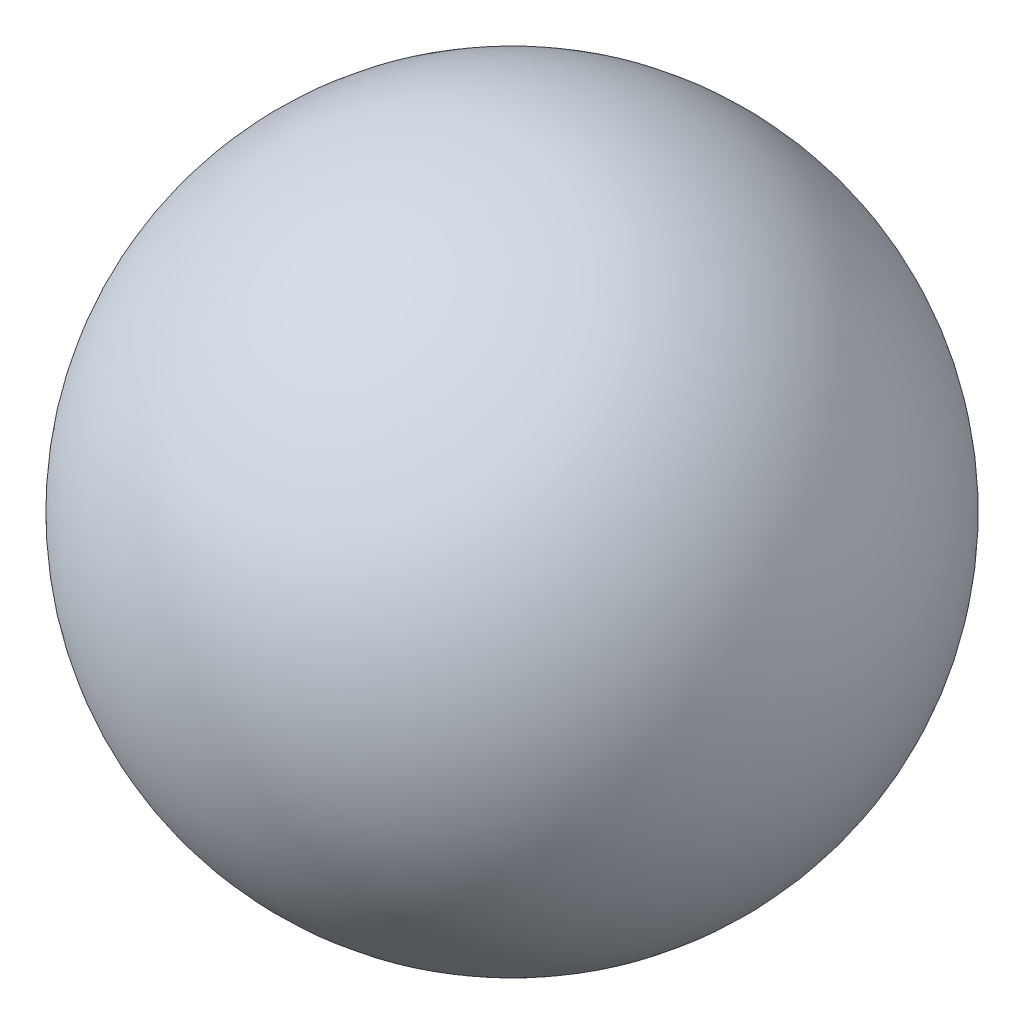
ISO-10303-21;
HEADER;
FILE_DESCRIPTION(('STEP AP214'),'2;1');
FILE_NAME('part.step','',(''),(''),'','','');
FILE_SCHEMA(('AUTOMOTIVE_DESIGN { 1 0 10303 214 1 1 1 1 }'));
ENDSEC;
DATA;
#1=APPLICATION_CONTEXT('core data for automotive mechanical design processes');
#2=APPLICATION_PROTOCOL_DEFINITION('international standard','automotive_design',2000,#1);
#3=PRODUCT_CONTEXT('',#1,'mechanical');
#4=PRODUCT('Part','Part','',(#3));
#5=PRODUCT_RELATED_PRODUCT_CATEGORY('part','',(#4));
#6=PRODUCT_DEFINITION_FORMATION('','',#4);
#7=PRODUCT_DEFINITION_CONTEXT('part definition',#1,'design');
#8=PRODUCT_DEFINITION('design','',#6,#7);
#9=PRODUCT_DEFINITION_SHAPE('','',#8);
#10=(LENGTH_UNIT() NAMED_UNIT(*) SI_UNIT(.MILLI.,.METRE.));
#11=(NAMED_UNIT(*) PLANE_ANGLE_UNIT() SI_UNIT($,.RADIAN.));
#12=(NAMED_UNIT(*) SI_UNIT($,.STERADIAN.) SOLID_ANGLE_UNIT());
#13=UNCERTAINTY_MEASURE_WITH_UNIT(LENGTH_MEASURE(1.E-05),#10,'distance_accuracy_value','');
#14=(GEOMETRIC_REPRESENTATION_CONTEXT(3) GLOBAL_UNCERTAINTY_ASSIGNED_CONTEXT((#13)) GLOBAL_UNIT_ASSIGNED_CONTEXT((#10,
#11,#12)) REPRESENTATION_CONTEXT('',''));
#15=CARTESIAN_POINT('',(0.,0.,0.));
#16=DIRECTION('',(0.,0.,1.));
#17=DIRECTION('',(1.,0.,0.));
#18=AXIS2_PLACEMENT_3D('',#15,#16,#17);
#19=CARTESIAN_POINT('',(0.,136.091710888394,0.));
#20=DIRECTION('',(0.,1.,0.));
#21=DIRECTION('',(1.,0.,0.));
#22=AXIS2_PLACEMENT_3D('',#19,#20,#21);
#23=SPHERICAL_SURFACE('',#22,136.091710888394);
#24=CARTESIAN_POINT('',(0.,272.183421776788,0.));
#25=VERTEX_POINT('',#24);
#26=VERTEX_LOOP('',#25);
#27=FACE_BOUND('',#26,.T.);
#28=ADVANCED_FACE('F39',(#27),#23,.T.);
#29=CLOSED_SHELL('',(#28));
#30=MANIFOLD_SOLID_BREP('B2',#29);
#31=ADVANCED_BREP_SHAPE_REPRESENTATION('',(#18,#30),#14);
#32=SHAPE_DEFINITION_REPRESENTATION(#9,#31);
ENDSEC;
END-ISO-10303-21;
